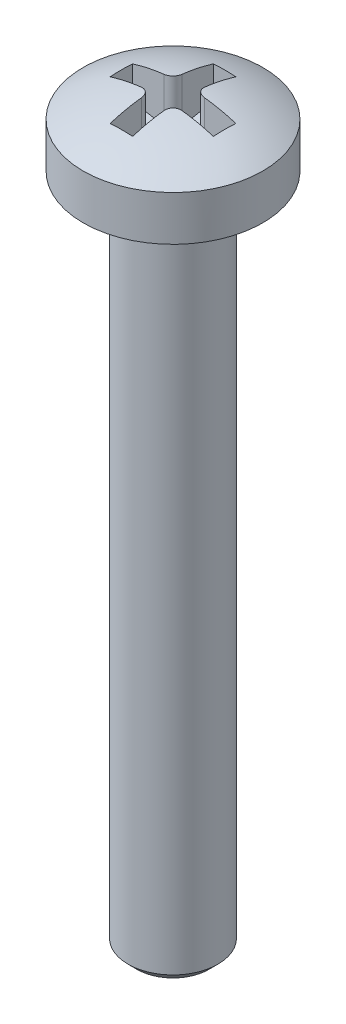
ISO-10303-21;
HEADER;
FILE_DESCRIPTION(('STEP AP214'),'2;1');
FILE_NAME('part.step','',(''),(''),'','','');
FILE_SCHEMA(('AUTOMOTIVE_DESIGN { 1 0 10303 214 1 1 1 1 }'));
ENDSEC;
DATA;
#1=APPLICATION_CONTEXT('core data for automotive mechanical design processes');
#2=APPLICATION_PROTOCOL_DEFINITION('international standard','automotive_design',2000,#1);
#3=PRODUCT_CONTEXT('',#1,'mechanical');
#4=PRODUCT('Part','Part','',(#3));
#5=PRODUCT_RELATED_PRODUCT_CATEGORY('part','',(#4));
#6=PRODUCT_DEFINITION_FORMATION('','',#4);
#7=PRODUCT_DEFINITION_CONTEXT('part definition',#1,'design');
#8=PRODUCT_DEFINITION('design','',#6,#7);
#9=PRODUCT_DEFINITION_SHAPE('','',#8);
#10=(LENGTH_UNIT() NAMED_UNIT(*) SI_UNIT(.MILLI.,.METRE.));
#11=(NAMED_UNIT(*) PLANE_ANGLE_UNIT() SI_UNIT($,.RADIAN.));
#12=(NAMED_UNIT(*) SI_UNIT($,.STERADIAN.) SOLID_ANGLE_UNIT());
#13=UNCERTAINTY_MEASURE_WITH_UNIT(LENGTH_MEASURE(1.E-05),#10,'distance_accuracy_value','');
#14=(GEOMETRIC_REPRESENTATION_CONTEXT(3) GLOBAL_UNCERTAINTY_ASSIGNED_CONTEXT((#13)) GLOBAL_UNIT_ASSIGNED_CONTEXT((#10,
#11,#12)) REPRESENTATION_CONTEXT('',''));
#15=CARTESIAN_POINT('',(0.,0.,0.));
#16=DIRECTION('',(0.,0.,1.));
#17=DIRECTION('',(1.,0.,0.));
#18=AXIS2_PLACEMENT_3D('',#15,#16,#17);
#19=CARTESIAN_POINT('',(2.,-30.,0.));
#20=DIRECTION('',(0.,1.,0.));
#21=DIRECTION('',(0.,0.,1.));
#22=AXIS2_PLACEMENT_3D('',#19,#20,#21);
#23=PLANE('',#22);
#24=CARTESIAN_POINT('',(0.,-30.,0.));
#25=DIRECTION('',(0.,1.,0.));
#26=DIRECTION('',(0.,0.,1.));
#27=AXIS2_PLACEMENT_3D('',#24,#25,#26);
#28=CIRCLE('',#27,1.60000000000001);
#29=CARTESIAN_POINT('',(0.,-30.,1.60000000000001));
#30=VERTEX_POINT('',#29);
#31=EDGE_CURVE('E11',#30,#30,#28,.F.);
#32=ORIENTED_EDGE('',*,*,#31,.T.);
#33=EDGE_LOOP('',(#32));
#34=FACE_BOUND('',#33,.T.);
#35=ADVANCED_FACE('F37',(#34),#23,.F.);
#36=CARTESIAN_POINT('',(0.,-4.72272727272728,0.));
#37=DIRECTION('',(0.,1.,0.));
#38=DIRECTION('',(1.,0.,0.));
#39=AXIS2_PLACEMENT_3D('',#36,#37,#38);
#40=SPHERICAL_SURFACE('',#39,7.82272727272728);
#41=CARTESIAN_POINT('',(0.5,-4.72272727272728,0.));
#42=DIRECTION('',(1.,0.,0.));
#43=DIRECTION('',(0.,0.,-1.));
#44=AXIS2_PLACEMENT_3D('',#41,#42,#43);
#45=CIRCLE('',#44,7.80673183755348);
#46=CARTESIAN_POINT('',(0.5,2.73750476008987,-2.3));
#47=VERTEX_POINT('',#46);
#48=CARTESIAN_POINT('',(0.5,3.03195273249996,-0.9));
#49=VERTEX_POINT('',#48);
#50=EDGE_CURVE('E195',#47,#49,#45,.T.);
#51=ORIENTED_EDGE('',*,*,#50,.T.);
#52=CARTESIAN_POINT('',(0.5,3.03195273249996,-0.9));
#53=CARTESIAN_POINT('',(0.499980445653111,3.03454133641409,-0.877715199489853));
#54=CARTESIAN_POINT('',(0.501861325410847,3.0369109081898,-0.855406290685576));
#55=CARTESIAN_POINT('',(0.509308944557218,3.04115309750786,-0.811373363194762));
#56=CARTESIAN_POINT('',(0.514874142284133,3.04302592244948,-0.789649103823202));
#57=CARTESIAN_POINT('',(0.529581237998282,3.04621922226135,-0.747382590966706));
#58=CARTESIAN_POINT('',(0.538725894104163,3.0475392695665,-0.726841263013532));
#59=CARTESIAN_POINT('',(0.560335395409864,3.04958563422558,-0.687561895208892));
#60=CARTESIAN_POINT('',(0.572799188800053,3.05031213937239,-0.668823286645484));
#61=CARTESIAN_POINT('',(0.600596407799792,3.05114682561896,-0.633816736919395));
#62=CARTESIAN_POINT('',(0.615908512897499,3.05125942358876,-0.617531968951503));
#63=CARTESIAN_POINT('',(0.649026593510928,3.0508747494218,-0.587736528915892));
#64=CARTESIAN_POINT('',(0.666832948845617,3.05037738431157,-0.57422628012003));
#65=CARTESIAN_POINT('',(0.704363578386314,3.04879030089852,-0.550401537052683));
#66=CARTESIAN_POINT('',(0.724081674108829,3.04770244181268,-0.540077170971166));
#67=CARTESIAN_POINT('',(0.764919862434989,3.04496752601447,-0.522847557382613));
#68=CARTESIAN_POINT('',(0.786039420133905,3.04332068167708,-0.515941013789886));
#69=CARTESIAN_POINT('',(0.822714805755103,3.04007942212771,-0.5072274099574));
#70=CARTESIAN_POINT('',(0.838074093965798,3.03861284502167,-0.504517057384848));
#71=CARTESIAN_POINT('',(0.868957976534767,3.0354499847468,-0.500903202638105));
#72=CARTESIAN_POINT('',(0.88448230264661,3.03375403356009,-0.499997118337815));
#73=CARTESIAN_POINT('',(0.9,3.03195273249996,-0.5));
#74=B_SPLINE_CURVE_WITH_KNOTS('',3,(#52,#53,#54,#55,#56,#57,#58,#59,#60,#61,#62,#63,#64,#65,#66,
#67,#68,#69,#70,#71,#72,#73),.UNSPECIFIED.,.F.,.F.,(4,2,2,2,2,2,2,2,2,2,4),(0.,
0.0672224170043276,0.134416723302517,0.201662907801201,0.26888780779591,0.335628401088124,
0.402379168562592,0.468920974876219,0.535437528240593,0.582332561709017,0.629160434341086),.UNSPECIFIED.);
#75=CARTESIAN_POINT('',(0.9,3.03195273249996,-0.5));
#76=VERTEX_POINT('',#75);
#77=EDGE_CURVE('E257',#49,#76,#74,.T.);
#78=ORIENTED_EDGE('',*,*,#77,.T.);
#79=CARTESIAN_POINT('',(0.,-4.72272727272728,-0.5));
#80=DIRECTION('',(0.,0.,-1.));
#81=DIRECTION('',(-1.,0.,0.));
#82=AXIS2_PLACEMENT_3D('',#79,#80,#81);
#83=CIRCLE('',#82,7.80673183755348);
#84=CARTESIAN_POINT('',(2.3,2.73750476008987,-0.5));
#85=VERTEX_POINT('',#84);
#86=EDGE_CURVE('E193',#76,#85,#83,.T.);
#87=ORIENTED_EDGE('',*,*,#86,.T.);
#88=CARTESIAN_POINT('',(2.3,-4.72272727272728,0.));
#89=DIRECTION('',(1.,0.,0.));
#90=DIRECTION('',(0.,0.,-1.));
#91=AXIS2_PLACEMENT_3D('',#88,#89,#90);
#92=CIRCLE('',#91,7.47696876972688);
#93=CARTESIAN_POINT('',(2.3,2.73750476008987,0.5));
#94=VERTEX_POINT('',#93);
#95=EDGE_CURVE('E170',#85,#94,#92,.T.);
#96=ORIENTED_EDGE('',*,*,#95,.T.);
#97=CARTESIAN_POINT('',(0.,-4.72272727272728,0.5));
#98=DIRECTION('',(0.,0.,1.));
#99=DIRECTION('',(1.,0.,0.));
#100=AXIS2_PLACEMENT_3D('',#97,#98,#99);
#101=CIRCLE('',#100,7.80673183755348);
#102=CARTESIAN_POINT('',(0.9,3.03195273249996,0.5));
#103=VERTEX_POINT('',#102);
#104=EDGE_CURVE('E219',#94,#103,#101,.T.);
#105=ORIENTED_EDGE('',*,*,#104,.T.);
#106=CARTESIAN_POINT('',(0.9,3.03195273249996,0.5));
#107=CARTESIAN_POINT('',(0.877715199489853,3.03454133641409,0.499980445653111));
#108=CARTESIAN_POINT('',(0.855406290685576,3.0369109081898,0.501861325410847));
#109=CARTESIAN_POINT('',(0.811373363194762,3.04115309750786,0.509308944557218));
#110=CARTESIAN_POINT('',(0.789649103823202,3.04302592244948,0.514874142284133));
#111=CARTESIAN_POINT('',(0.747382590966706,3.04621922226135,0.529581237998282));
#112=CARTESIAN_POINT('',(0.726841263013532,3.0475392695665,0.538725894104163));
#113=CARTESIAN_POINT('',(0.687561895208891,3.04958563422558,0.560335395409864));
#114=CARTESIAN_POINT('',(0.668823286645484,3.05031213937239,0.572799188800053));
#115=CARTESIAN_POINT('',(0.633816736919395,3.05114682561896,0.600596407799792));
#116=CARTESIAN_POINT('',(0.617531968951503,3.05125942358877,0.6159085128975));
#117=CARTESIAN_POINT('',(0.587736528915892,3.0508747494218,0.649026593510929));
#118=CARTESIAN_POINT('',(0.57422628012003,3.05037738431157,0.666832948845617));
#119=CARTESIAN_POINT('',(0.550401537052683,3.04879030089852,0.704363578386314));
#120=CARTESIAN_POINT('',(0.540077170971166,3.04770244181268,0.724081674108829));
#121=CARTESIAN_POINT('',(0.522847557382613,3.04496752601447,0.764919862434989));
#122=CARTESIAN_POINT('',(0.515941013789886,3.04332068167708,0.786039420133905));
#123=CARTESIAN_POINT('',(0.5072274099574,3.04007942212771,0.822714805755103));
#124=CARTESIAN_POINT('',(0.504517057384848,3.03861284502167,0.838074093965798));
#125=CARTESIAN_POINT('',(0.500903202638105,3.03544998474679,0.868957976534767));
#126=CARTESIAN_POINT('',(0.499997118337815,3.03375403356009,0.884482302646609));
#127=CARTESIAN_POINT('',(0.5,3.03195273249996,0.9));
#128=B_SPLINE_CURVE_WITH_KNOTS('',3,(#106,#107,#108,#109,#110,#111,#112,#113,#114,#115,#116,
#117,#118,#119,#120,#121,#122,#123,#124,#125,#126,#127),.UNSPECIFIED.,.F.,.F.,(4,2,2,2,2,2,2,2,
2,2,4),(0.,0.0672224170043276,0.134416723302517,0.201662907801201,0.268887807795911,
0.335628401088124,0.402379168562592,0.468920974876219,0.535437528240593,0.582332561709017,
0.629160434341086),.UNSPECIFIED.);
#129=CARTESIAN_POINT('',(0.5,3.03195273249996,0.9));
#130=VERTEX_POINT('',#129);
#131=EDGE_CURVE('E252',#103,#130,#128,.T.);
#132=ORIENTED_EDGE('',*,*,#131,.T.);
#133=CARTESIAN_POINT('',(0.5,-4.72272727272728,0.));
#134=DIRECTION('',(1.,0.,0.));
#135=DIRECTION('',(0.,0.,-1.));
#136=AXIS2_PLACEMENT_3D('',#133,#134,#135);
#137=CIRCLE('',#136,7.80673183755348);
#138=CARTESIAN_POINT('',(0.5,2.73750476008987,2.3));
#139=VERTEX_POINT('',#138);
#140=EDGE_CURVE('E217',#130,#139,#137,.T.);
#141=ORIENTED_EDGE('',*,*,#140,.T.);
#142=CARTESIAN_POINT('',(0.,-4.72272727272728,2.3));
#143=DIRECTION('',(0.,0.,1.));
#144=DIRECTION('',(1.,0.,0.));
#145=AXIS2_PLACEMENT_3D('',#142,#143,#144);
#146=CIRCLE('',#145,7.47696876972688);
#147=CARTESIAN_POINT('',(-0.5,2.73750476008987,2.3));
#148=VERTEX_POINT('',#147);
#149=EDGE_CURVE('E214',#139,#148,#146,.T.);
#150=ORIENTED_EDGE('',*,*,#149,.T.);
#151=CARTESIAN_POINT('',(-0.5,-4.72272727272728,0.));
#152=DIRECTION('',(-1.,0.,0.));
#153=DIRECTION('',(0.,0.,1.));
#154=AXIS2_PLACEMENT_3D('',#151,#152,#153);
#155=CIRCLE('',#154,7.80673183755348);
#156=CARTESIAN_POINT('',(-0.5,3.03195273249996,0.9));
#157=VERTEX_POINT('',#156);
#158=EDGE_CURVE('E211',#148,#157,#155,.T.);
#159=ORIENTED_EDGE('',*,*,#158,.T.);
#160=CARTESIAN_POINT('',(-0.5,3.03195273249996,0.9));
#161=CARTESIAN_POINT('',(-0.499980445653111,3.03454133641409,0.877715199489853));
#162=CARTESIAN_POINT('',(-0.501861325410847,3.0369109081898,0.855406290685576));
#163=CARTESIAN_POINT('',(-0.509308944557218,3.04115309750786,0.811373363194762));
#164=CARTESIAN_POINT('',(-0.514874142284133,3.04302592244948,0.789649103823202));
#165=CARTESIAN_POINT('',(-0.529581237998282,3.04621922226135,0.747382590966706));
#166=CARTESIAN_POINT('',(-0.538725894104163,3.0475392695665,0.726841263013532));
#167=CARTESIAN_POINT('',(-0.560335395409864,3.04958563422558,0.687561895208892));
#168=CARTESIAN_POINT('',(-0.572799188800053,3.05031213937239,0.668823286645484));
#169=CARTESIAN_POINT('',(-0.600596407799792,3.05114682561896,0.633816736919395));
#170=CARTESIAN_POINT('',(-0.6159085128975,3.05125942358876,0.617531968951503));
#171=CARTESIAN_POINT('',(-0.649026593510929,3.0508747494218,0.587736528915892));
#172=CARTESIAN_POINT('',(-0.666832948845617,3.05037738431157,0.57422628012003));
#173=CARTESIAN_POINT('',(-0.704363578386314,3.04879030089852,0.550401537052683));
#174=CARTESIAN_POINT('',(-0.724081674108829,3.04770244181268,0.540077170971166));
#175=CARTESIAN_POINT('',(-0.764919862434989,3.04496752601447,0.522847557382613));
#176=CARTESIAN_POINT('',(-0.786039420133905,3.04332068167708,0.515941013789887));
#177=CARTESIAN_POINT('',(-0.822714805755103,3.04007942212771,0.5072274099574));
#178=CARTESIAN_POINT('',(-0.838074093965798,3.03861284502167,0.504517057384848));
#179=CARTESIAN_POINT('',(-0.868957976534767,3.0354499847468,0.500903202638105));
#180=CARTESIAN_POINT('',(-0.88448230264661,3.03375403356009,0.499997118337815));
#181=CARTESIAN_POINT('',(-0.9,3.03195273249996,0.5));
#182=B_SPLINE_CURVE_WITH_KNOTS('',3,(#160,#161,#162,#163,#164,#165,#166,#167,#168,#169,#170,
#171,#172,#173,#174,#175,#176,#177,#178,#179,#180,#181),.UNSPECIFIED.,.F.,.F.,(4,2,2,2,2,2,2,2,
2,2,4),(0.,0.0672224170043276,0.134416723302517,0.201662907801201,0.26888780779591,
0.335628401088124,0.402379168562592,0.468920974876219,0.535437528240592,0.582332561709017,
0.629160434341086),.UNSPECIFIED.);
#183=CARTESIAN_POINT('',(-0.9,3.03195273249996,0.5));
#184=VERTEX_POINT('',#183);
#185=EDGE_CURVE('E231',#157,#184,#182,.T.);
#186=ORIENTED_EDGE('',*,*,#185,.T.);
#187=CARTESIAN_POINT('',(0.,-4.72272727272728,0.5));
#188=DIRECTION('',(0.,0.,1.));
#189=DIRECTION('',(1.,0.,0.));
#190=AXIS2_PLACEMENT_3D('',#187,#188,#189);
#191=CIRCLE('',#190,7.80673183755348);
#192=CARTESIAN_POINT('',(-2.3,2.73750476008987,0.5));
#193=VERTEX_POINT('',#192);
#194=EDGE_CURVE('E209',#184,#193,#191,.T.);
#195=ORIENTED_EDGE('',*,*,#194,.T.);
#196=CARTESIAN_POINT('',(-2.3,-4.72272727272728,0.));
#197=DIRECTION('',(-1.,0.,0.));
#198=DIRECTION('',(0.,0.,1.));
#199=AXIS2_PLACEMENT_3D('',#196,#197,#198);
#200=CIRCLE('',#199,7.47696876972688);
#201=CARTESIAN_POINT('',(-2.3,2.73750476008987,-0.5));
#202=VERTEX_POINT('',#201);
#203=EDGE_CURVE('E206',#193,#202,#200,.T.);
#204=ORIENTED_EDGE('',*,*,#203,.T.);
#205=CARTESIAN_POINT('',(0.,-4.72272727272728,-0.5));
#206=DIRECTION('',(0.,0.,-1.));
#207=DIRECTION('',(-1.,0.,0.));
#208=AXIS2_PLACEMENT_3D('',#205,#206,#207);
#209=CIRCLE('',#208,7.80673183755348);
#210=CARTESIAN_POINT('',(-0.9,3.03195273249996,-0.5));
#211=VERTEX_POINT('',#210);
#212=EDGE_CURVE('E203',#202,#211,#209,.T.);
#213=ORIENTED_EDGE('',*,*,#212,.T.);
#214=CARTESIAN_POINT('',(-0.9,3.03195273249996,-0.5));
#215=CARTESIAN_POINT('',(-0.877715199489853,3.03454133641409,-0.499980445653111));
#216=CARTESIAN_POINT('',(-0.855406290685576,3.0369109081898,-0.501861325410847));
#217=CARTESIAN_POINT('',(-0.811373363194762,3.04115309750786,-0.509308944557218));
#218=CARTESIAN_POINT('',(-0.789649103823202,3.04302592244948,-0.514874142284133));
#219=CARTESIAN_POINT('',(-0.747382590966706,3.04621922226135,-0.529581237998282));
#220=CARTESIAN_POINT('',(-0.726841263013532,3.0475392695665,-0.538725894104163));
#221=CARTESIAN_POINT('',(-0.687561895208892,3.04958563422558,-0.560335395409864));
#222=CARTESIAN_POINT('',(-0.668823286645484,3.05031213937239,-0.572799188800053));
#223=CARTESIAN_POINT('',(-0.633816736919395,3.05114682561896,-0.600596407799792));
#224=CARTESIAN_POINT('',(-0.617531968951503,3.05125942358877,-0.6159085128975));
#225=CARTESIAN_POINT('',(-0.587736528915892,3.0508747494218,-0.649026593510929));
#226=CARTESIAN_POINT('',(-0.57422628012003,3.05037738431157,-0.666832948845617));
#227=CARTESIAN_POINT('',(-0.550401537052683,3.04879030089852,-0.704363578386314));
#228=CARTESIAN_POINT('',(-0.540077170971166,3.04770244181268,-0.724081674108829));
#229=CARTESIAN_POINT('',(-0.522847557382613,3.04496752601447,-0.764919862434989));
#230=CARTESIAN_POINT('',(-0.515941013789887,3.04332068167708,-0.786039420133905));
#231=CARTESIAN_POINT('',(-0.5072274099574,3.04007942212771,-0.822714805755103));
#232=CARTESIAN_POINT('',(-0.504517057384848,3.03861284502167,-0.838074093965798));
#233=CARTESIAN_POINT('',(-0.500903202638105,3.03544998474679,-0.868957976534767));
#234=CARTESIAN_POINT('',(-0.499997118337815,3.03375403356009,-0.88448230264661));
#235=CARTESIAN_POINT('',(-0.5,3.03195273249996,-0.9));
#236=B_SPLINE_CURVE_WITH_KNOTS('',3,(#214,#215,#216,#217,#218,#219,#220,#221,#222,#223,#224,
#225,#226,#227,#228,#229,#230,#231,#232,#233,#234,#235),.UNSPECIFIED.,.F.,.F.,(4,2,2,2,2,2,2,2,
2,2,4),(0.,0.0672224170043276,0.134416723302517,0.201662907801201,0.268887807795911,
0.335628401088124,0.402379168562592,0.468920974876219,0.535437528240593,0.582332561709018,
0.629160434341086),.UNSPECIFIED.);
#237=CARTESIAN_POINT('',(-0.5,3.03195273249996,-0.9));
#238=VERTEX_POINT('',#237);
#239=EDGE_CURVE('E225',#211,#238,#236,.T.);
#240=ORIENTED_EDGE('',*,*,#239,.T.);
#241=CARTESIAN_POINT('',(-0.5,-4.72272727272728,0.));
#242=DIRECTION('',(-1.,0.,0.));
#243=DIRECTION('',(0.,0.,1.));
#244=AXIS2_PLACEMENT_3D('',#241,#242,#243);
#245=CIRCLE('',#244,7.80673183755348);
#246=CARTESIAN_POINT('',(-0.5,2.73750476008987,-2.3));
#247=VERTEX_POINT('',#246);
#248=EDGE_CURVE('E201',#238,#247,#245,.T.);
#249=ORIENTED_EDGE('',*,*,#248,.T.);
#250=CARTESIAN_POINT('',(0.,-4.72272727272728,-2.3));
#251=DIRECTION('',(0.,0.,-1.));
#252=DIRECTION('',(-1.,0.,0.));
#253=AXIS2_PLACEMENT_3D('',#250,#251,#252);
#254=CIRCLE('',#253,7.47696876972688);
#255=EDGE_CURVE('E198',#247,#47,#254,.T.);
#256=ORIENTED_EDGE('',*,*,#255,.T.);
#257=EDGE_LOOP('',(#51,#78,#87,#96,#105,#132,#141,#150,#159,#186,#195,#204,#213,#240,#249,#256));
#258=FACE_BOUND('',#257,.T.);
#259=CARTESIAN_POINT('',(0.,2.,0.));
#260=DIRECTION('',(0.,1.,0.));
#261=DIRECTION('',(0.,0.,1.));
#262=AXIS2_PLACEMENT_3D('',#259,#260,#261);
#263=CIRCLE('',#262,4.);
#264=CARTESIAN_POINT('',(0.,2.,4.));
#265=VERTEX_POINT('',#264);
#266=EDGE_CURVE('E189',#265,#265,#263,.T.);
#267=ORIENTED_EDGE('',*,*,#266,.T.);
#268=EDGE_LOOP('',(#267));
#269=FACE_BOUND('',#268,.T.);
#270=ADVANCED_FACE('F239',(#258,#269),#40,.T.);
#271=CARTESIAN_POINT('',(0.,3.1,0.));
#272=DIRECTION('',(0.,1.,0.));
#273=DIRECTION('',(0.,0.,1.));
#274=AXIS2_PLACEMENT_3D('',#271,#272,#273);
#275=CYLINDRICAL_SURFACE('',#274,4.);
#276=ORIENTED_EDGE('',*,*,#266,.F.);
#277=EDGE_LOOP('',(#276));
#278=FACE_BOUND('',#277,.T.);
#279=CARTESIAN_POINT('',(0.,0.,0.));
#280=DIRECTION('',(0.,1.,0.));
#281=DIRECTION('',(0.,0.,1.));
#282=AXIS2_PLACEMENT_3D('',#279,#280,#281);
#283=CIRCLE('',#282,4.);
#284=CARTESIAN_POINT('',(0.,0.,4.));
#285=VERTEX_POINT('',#284);
#286=EDGE_CURVE('E181',#285,#285,#283,.T.);
#287=ORIENTED_EDGE('',*,*,#286,.T.);
#288=EDGE_LOOP('',(#287));
#289=FACE_BOUND('',#288,.T.);
#290=ADVANCED_FACE('F244',(#278,#289),#275,.T.);
#291=CARTESIAN_POINT('',(4.,0.,0.));
#292=DIRECTION('',(0.,1.,0.));
#293=DIRECTION('',(0.,0.,1.));
#294=AXIS2_PLACEMENT_3D('',#291,#292,#293);
#295=PLANE('',#294);
#296=ORIENTED_EDGE('',*,*,#286,.F.);
#297=EDGE_LOOP('',(#296));
#298=FACE_BOUND('',#297,.T.);
#299=CARTESIAN_POINT('',(0.,0.,0.));
#300=DIRECTION('',(0.,1.,0.));
#301=DIRECTION('',(0.,0.,1.));
#302=AXIS2_PLACEMENT_3D('',#299,#300,#301);
#303=CIRCLE('',#302,2.);
#304=CARTESIAN_POINT('',(0.,0.,2.));
#305=VERTEX_POINT('',#304);
#306=EDGE_CURVE('E178',#305,#305,#303,.T.);
#307=ORIENTED_EDGE('',*,*,#306,.T.);
#308=EDGE_LOOP('',(#307));
#309=FACE_BOUND('',#308,.T.);
#310=ADVANCED_FACE('F331',(#298,#309),#295,.F.);
#311=CARTESIAN_POINT('',(0.,3.1,0.));
#312=DIRECTION('',(0.,1.,0.));
#313=DIRECTION('',(0.,0.,1.));
#314=AXIS2_PLACEMENT_3D('',#311,#312,#313);
#315=CYLINDRICAL_SURFACE('',#314,2.);
#316=CARTESIAN_POINT('',(0.,-29.6,0.));
#317=DIRECTION('',(0.,1.,0.));
#318=DIRECTION('',(0.,0.,1.));
#319=AXIS2_PLACEMENT_3D('',#316,#317,#318);
#320=CIRCLE('',#319,2.);
#321=CARTESIAN_POINT('',(0.,-29.6,2.));
#322=VERTEX_POINT('',#321);
#323=EDGE_CURVE('E45',#322,#322,#320,.T.);
#324=ORIENTED_EDGE('',*,*,#323,.T.);
#325=EDGE_LOOP('',(#324));
#326=FACE_BOUND('',#325,.T.);
#327=ORIENTED_EDGE('',*,*,#306,.F.);
#328=EDGE_LOOP('',(#327));
#329=FACE_BOUND('',#328,.T.);
#330=ADVANCED_FACE('F303',(#326,#329),#315,.T.);
#331=CARTESIAN_POINT('',(0.5,-30.001,0.5));
#332=DIRECTION('',(0.,0.,1.));
#333=DIRECTION('',(1.,0.,0.));
#334=AXIS2_PLACEMENT_3D('',#331,#332,#333);
#335=PLANE('',#334);
#336=CARTESIAN_POINT('',(0.,9.49999999999998,0.5));
#337=DIRECTION('',(0.,0.,1.));
#338=DIRECTION('',(1.,0.,0.));
#339=AXIS2_PLACEMENT_3D('',#336,#337,#338);
#340=CIRCLE('',#339,8.48528137423855);
#341=CARTESIAN_POINT('',(2.3,1.3323810079069,0.5));
#342=VERTEX_POINT('',#341);
#343=CARTESIAN_POINT('',(0.9,1.06258333374486,0.5));
#344=VERTEX_POINT('',#343);
#345=EDGE_CURVE('E176',#342,#344,#340,.F.);
#346=ORIENTED_EDGE('',*,*,#345,.T.);
#347=DIRECTION('',(0.,1.,0.));
#348=VECTOR('',#347,1.);
#349=CARTESIAN_POINT('',(0.9,-30.001,0.5));
#350=LINE('',#349,#348);
#351=EDGE_CURVE('E556',#344,#103,#350,.T.);
#352=ORIENTED_EDGE('',*,*,#351,.T.);
#353=ORIENTED_EDGE('',*,*,#104,.F.);
#354=DIRECTION('',(0.,1.,0.));
#355=VECTOR('',#354,1.);
#356=CARTESIAN_POINT('',(2.3,-30.001,0.5));
#357=LINE('',#356,#355);
#358=EDGE_CURVE('E172',#342,#94,#357,.T.);
#359=ORIENTED_EDGE('',*,*,#358,.F.);
#360=EDGE_LOOP('',(#346,#352,#353,#359));
#361=FACE_BOUND('',#360,.T.);
#362=ADVANCED_FACE('F344',(#361),#335,.F.);
#363=CARTESIAN_POINT('',(0.5,-30.001,0.5));
#364=DIRECTION('',(1.,0.,0.));
#365=DIRECTION('',(0.,0.,-1.));
#366=AXIS2_PLACEMENT_3D('',#363,#364,#365);
#367=PLANE('',#366);
#368=ORIENTED_EDGE('',*,*,#140,.F.);
#369=DIRECTION('',(0.,1.,0.));
#370=VECTOR('',#369,1.);
#371=CARTESIAN_POINT('',(0.5,-30.001,0.9));
#372=LINE('',#371,#370);
#373=CARTESIAN_POINT('',(0.5,1.06258333374486,0.9));
#374=VERTEX_POINT('',#373);
#375=EDGE_CURVE('E554',#130,#374,#372,.F.);
#376=ORIENTED_EDGE('',*,*,#375,.T.);
#377=CARTESIAN_POINT('',(0.5,9.49999999999998,0.));
#378=DIRECTION('',(1.,0.,0.));
#379=DIRECTION('',(0.,0.,-1.));
#380=AXIS2_PLACEMENT_3D('',#377,#378,#379);
#381=CIRCLE('',#380,8.48528137423855);
#382=CARTESIAN_POINT('',(0.5,1.3323810079069,2.3));
#383=VERTEX_POINT('',#382);
#384=EDGE_CURVE('E183',#374,#383,#381,.F.);
#385=ORIENTED_EDGE('',*,*,#384,.T.);
#386=DIRECTION('',(0.,1.,0.));
#387=VECTOR('',#386,1.);
#388=CARTESIAN_POINT('',(0.5,-30.001,2.3));
#389=LINE('',#388,#387);
#390=EDGE_CURVE('E162',#383,#139,#389,.T.);
#391=ORIENTED_EDGE('',*,*,#390,.T.);
#392=EDGE_LOOP('',(#368,#376,#385,#391));
#393=FACE_BOUND('',#392,.T.);
#394=ADVANCED_FACE('F292',(#393),#367,.F.);
#395=CARTESIAN_POINT('',(-0.5,-30.001,2.3));
#396=DIRECTION('',(0.,0.,1.));
#397=DIRECTION('',(1.,0.,0.));
#398=AXIS2_PLACEMENT_3D('',#395,#396,#397);
#399=PLANE('',#398);
#400=ORIENTED_EDGE('',*,*,#390,.F.);
#401=CARTESIAN_POINT('',(0.,9.49999999999998,2.3));
#402=DIRECTION('',(0.,0.,1.));
#403=DIRECTION('',(1.,0.,0.));
#404=AXIS2_PLACEMENT_3D('',#401,#402,#403);
#405=CIRCLE('',#404,8.18290901819149);
#406=CARTESIAN_POINT('',(-0.5,1.3323810079069,2.3));
#407=VERTEX_POINT('',#406);
#408=EDGE_CURVE('E518',#383,#407,#405,.F.);
#409=ORIENTED_EDGE('',*,*,#408,.T.);
#410=DIRECTION('',(0.,1.,0.));
#411=VECTOR('',#410,1.);
#412=CARTESIAN_POINT('',(-0.5,-30.001,2.3));
#413=LINE('',#412,#411);
#414=EDGE_CURVE('E517',#407,#148,#413,.T.);
#415=ORIENTED_EDGE('',*,*,#414,.T.);
#416=ORIENTED_EDGE('',*,*,#149,.F.);
#417=EDGE_LOOP('',(#400,#409,#415,#416));
#418=FACE_BOUND('',#417,.T.);
#419=ADVANCED_FACE('F357',(#418),#399,.F.);
#420=CARTESIAN_POINT('',(-0.5,-30.001,0.5));
#421=DIRECTION('',(-1.,0.,0.));
#422=DIRECTION('',(0.,0.,1.));
#423=AXIS2_PLACEMENT_3D('',#420,#421,#422);
#424=PLANE('',#423);
#425=CARTESIAN_POINT('',(-0.5,9.49999999999998,0.));
#426=DIRECTION('',(-1.,0.,0.));
#427=DIRECTION('',(0.,0.,1.));
#428=AXIS2_PLACEMENT_3D('',#425,#426,#427);
#429=CIRCLE('',#428,8.48528137423855);
#430=CARTESIAN_POINT('',(-0.5,1.06258333374486,0.9));
#431=VERTEX_POINT('',#430);
#432=EDGE_CURVE('E512',#407,#431,#429,.F.);
#433=ORIENTED_EDGE('',*,*,#432,.T.);
#434=DIRECTION('',(0.,1.,0.));
#435=VECTOR('',#434,1.);
#436=CARTESIAN_POINT('',(-0.5,-30.001,0.9));
#437=LINE('',#436,#435);
#438=EDGE_CURVE('E507',#431,#157,#437,.T.);
#439=ORIENTED_EDGE('',*,*,#438,.T.);
#440=ORIENTED_EDGE('',*,*,#158,.F.);
#441=ORIENTED_EDGE('',*,*,#414,.F.);
#442=EDGE_LOOP('',(#433,#439,#440,#441));
#443=FACE_BOUND('',#442,.T.);
#444=ADVANCED_FACE('F364',(#443),#424,.F.);
#445=CARTESIAN_POINT('',(-2.3,-30.001,0.5));
#446=DIRECTION('',(0.,0.,1.));
#447=DIRECTION('',(1.,0.,0.));
#448=AXIS2_PLACEMENT_3D('',#445,#446,#447);
#449=PLANE('',#448);
#450=ORIENTED_EDGE('',*,*,#194,.F.);
#451=DIRECTION('',(0.,1.,0.));
#452=VECTOR('',#451,1.);
#453=CARTESIAN_POINT('',(-0.9,-30.001,0.5));
#454=LINE('',#453,#452);
#455=CARTESIAN_POINT('',(-0.9,1.06258333374486,0.5));
#456=VERTEX_POINT('',#455);
#457=EDGE_CURVE('E505',#184,#456,#454,.F.);
#458=ORIENTED_EDGE('',*,*,#457,.T.);
#459=CARTESIAN_POINT('',(0.,9.49999999999998,0.5));
#460=DIRECTION('',(0.,0.,1.));
#461=DIRECTION('',(1.,0.,0.));
#462=AXIS2_PLACEMENT_3D('',#459,#460,#461);
#463=CIRCLE('',#462,8.48528137423855);
#464=CARTESIAN_POINT('',(-2.3,1.3323810079069,0.5));
#465=VERTEX_POINT('',#464);
#466=EDGE_CURVE('E515',#456,#465,#463,.F.);
#467=ORIENTED_EDGE('',*,*,#466,.T.);
#468=DIRECTION('',(0.,1.,0.));
#469=VECTOR('',#468,1.);
#470=CARTESIAN_POINT('',(-2.3,-30.001,0.5));
#471=LINE('',#470,#469);
#472=EDGE_CURVE('E529',#465,#193,#471,.T.);
#473=ORIENTED_EDGE('',*,*,#472,.T.);
#474=EDGE_LOOP('',(#450,#458,#467,#473));
#475=FACE_BOUND('',#474,.T.);
#476=ADVANCED_FACE('F371',(#475),#449,.F.);
#477=CARTESIAN_POINT('',(-2.3,-30.001,-0.5));
#478=DIRECTION('',(-1.,0.,0.));
#479=DIRECTION('',(0.,0.,1.));
#480=AXIS2_PLACEMENT_3D('',#477,#478,#479);
#481=PLANE('',#480);
#482=ORIENTED_EDGE('',*,*,#472,.F.);
#483=CARTESIAN_POINT('',(-2.3,9.49999999999998,0.));
#484=DIRECTION('',(-1.,0.,0.));
#485=DIRECTION('',(0.,0.,1.));
#486=AXIS2_PLACEMENT_3D('',#483,#484,#485);
#487=CIRCLE('',#486,8.18290901819149);
#488=CARTESIAN_POINT('',(-2.3,1.3323810079069,-0.5));
#489=VERTEX_POINT('',#488);
#490=EDGE_CURVE('E521',#465,#489,#487,.F.);
#491=ORIENTED_EDGE('',*,*,#490,.T.);
#492=DIRECTION('',(0.,1.,0.));
#493=VECTOR('',#492,1.);
#494=CARTESIAN_POINT('',(-2.3,-30.001,-0.5));
#495=LINE('',#494,#493);
#496=EDGE_CURVE('E532',#489,#202,#495,.T.);
#497=ORIENTED_EDGE('',*,*,#496,.T.);
#498=ORIENTED_EDGE('',*,*,#203,.F.);
#499=EDGE_LOOP('',(#482,#491,#497,#498));
#500=FACE_BOUND('',#499,.T.);
#501=ADVANCED_FACE('F379',(#500),#481,.F.);
#502=CARTESIAN_POINT('',(-2.3,-30.001,-0.5));
#503=DIRECTION('',(0.,0.,-1.));
#504=DIRECTION('',(-1.,0.,0.));
#505=AXIS2_PLACEMENT_3D('',#502,#503,#504);
#506=PLANE('',#505);
#507=CARTESIAN_POINT('',(0.,9.49999999999998,-0.5));
#508=DIRECTION('',(0.,0.,-1.));
#509=DIRECTION('',(-1.,0.,0.));
#510=AXIS2_PLACEMENT_3D('',#507,#508,#509);
#511=CIRCLE('',#510,8.48528137423855);
#512=CARTESIAN_POINT('',(-0.9,1.06258333374486,-0.5));
#513=VERTEX_POINT('',#512);
#514=EDGE_CURVE('E564',#489,#513,#511,.F.);
#515=ORIENTED_EDGE('',*,*,#514,.T.);
#516=DIRECTION('',(0.,1.,0.));
#517=VECTOR('',#516,1.);
#518=CARTESIAN_POINT('',(-0.9,-30.001,-0.5));
#519=LINE('',#518,#517);
#520=EDGE_CURVE('E549',#513,#211,#519,.T.);
#521=ORIENTED_EDGE('',*,*,#520,.T.);
#522=ORIENTED_EDGE('',*,*,#212,.F.);
#523=ORIENTED_EDGE('',*,*,#496,.F.);
#524=EDGE_LOOP('',(#515,#521,#522,#523));
#525=FACE_BOUND('',#524,.T.);
#526=ADVANCED_FACE('F387',(#525),#506,.F.);
#527=CARTESIAN_POINT('',(-0.5,-30.001,-2.3));
#528=DIRECTION('',(-1.,0.,0.));
#529=DIRECTION('',(0.,0.,1.));
#530=AXIS2_PLACEMENT_3D('',#527,#528,#529);
#531=PLANE('',#530);
#532=ORIENTED_EDGE('',*,*,#248,.F.);
#533=DIRECTION('',(0.,1.,0.));
#534=VECTOR('',#533,1.);
#535=CARTESIAN_POINT('',(-0.5,-30.001,-0.9));
#536=LINE('',#535,#534);
#537=CARTESIAN_POINT('',(-0.5,1.06258333374486,-0.9));
#538=VERTEX_POINT('',#537);
#539=EDGE_CURVE('E52',#238,#538,#536,.F.);
#540=ORIENTED_EDGE('',*,*,#539,.T.);
#541=CARTESIAN_POINT('',(-0.5,9.49999999999998,0.));
#542=DIRECTION('',(-1.,0.,0.));
#543=DIRECTION('',(0.,0.,1.));
#544=AXIS2_PLACEMENT_3D('',#541,#542,#543);
#545=CIRCLE('',#544,8.48528137423855);
#546=CARTESIAN_POINT('',(-0.5,1.3323810079069,-2.3));
#547=VERTEX_POINT('',#546);
#548=EDGE_CURVE('E560',#538,#547,#545,.F.);
#549=ORIENTED_EDGE('',*,*,#548,.T.);
#550=DIRECTION('',(0.,1.,0.));
#551=VECTOR('',#550,1.);
#552=CARTESIAN_POINT('',(-0.5,-30.001,-2.3));
#553=LINE('',#552,#551);
#554=EDGE_CURVE('E535',#547,#247,#553,.T.);
#555=ORIENTED_EDGE('',*,*,#554,.T.);
#556=EDGE_LOOP('',(#532,#540,#549,#555));
#557=FACE_BOUND('',#556,.T.);
#558=ADVANCED_FACE('F395',(#557),#531,.F.);
#559=CARTESIAN_POINT('',(-0.5,-30.001,-2.3));
#560=DIRECTION('',(0.,0.,-1.));
#561=DIRECTION('',(-1.,0.,0.));
#562=AXIS2_PLACEMENT_3D('',#559,#560,#561);
#563=PLANE('',#562);
#564=ORIENTED_EDGE('',*,*,#554,.F.);
#565=CARTESIAN_POINT('',(0.,9.49999999999998,-2.3));
#566=DIRECTION('',(0.,0.,-1.));
#567=DIRECTION('',(-1.,0.,0.));
#568=AXIS2_PLACEMENT_3D('',#565,#566,#567);
#569=CIRCLE('',#568,8.18290901819149);
#570=CARTESIAN_POINT('',(0.5,1.3323810079069,-2.3));
#571=VERTEX_POINT('',#570);
#572=EDGE_CURVE('E543',#547,#571,#569,.F.);
#573=ORIENTED_EDGE('',*,*,#572,.T.);
#574=DIRECTION('',(0.,1.,0.));
#575=VECTOR('',#574,1.);
#576=CARTESIAN_POINT('',(0.5,-30.001,-2.3));
#577=LINE('',#576,#575);
#578=EDGE_CURVE('E171',#571,#47,#577,.T.);
#579=ORIENTED_EDGE('',*,*,#578,.T.);
#580=ORIENTED_EDGE('',*,*,#255,.F.);
#581=EDGE_LOOP('',(#564,#573,#579,#580));
#582=FACE_BOUND('',#581,.T.);
#583=ADVANCED_FACE('F403',(#582),#563,.F.);
#584=CARTESIAN_POINT('',(0.5,-30.001,-2.3));
#585=DIRECTION('',(1.,0.,0.));
#586=DIRECTION('',(0.,0.,-1.));
#587=AXIS2_PLACEMENT_3D('',#584,#585,#586);
#588=PLANE('',#587);
#589=CARTESIAN_POINT('',(0.5,9.49999999999998,0.));
#590=DIRECTION('',(1.,0.,0.));
#591=DIRECTION('',(0.,0.,-1.));
#592=AXIS2_PLACEMENT_3D('',#589,#590,#591);
#593=CIRCLE('',#592,8.48528137423855);
#594=CARTESIAN_POINT('',(0.5,1.06258333374486,-0.9));
#595=VERTEX_POINT('',#594);
#596=EDGE_CURVE('E161',#571,#595,#593,.F.);
#597=ORIENTED_EDGE('',*,*,#596,.T.);
#598=DIRECTION('',(0.,1.,0.));
#599=VECTOR('',#598,1.);
#600=CARTESIAN_POINT('',(0.5,-30.001,-0.9));
#601=LINE('',#600,#599);
#602=EDGE_CURVE('E222',#595,#49,#601,.T.);
#603=ORIENTED_EDGE('',*,*,#602,.T.);
#604=ORIENTED_EDGE('',*,*,#50,.F.);
#605=ORIENTED_EDGE('',*,*,#578,.F.);
#606=EDGE_LOOP('',(#597,#603,#604,#605));
#607=FACE_BOUND('',#606,.T.);
#608=ADVANCED_FACE('F410',(#607),#588,.F.);
#609=CARTESIAN_POINT('',(0.5,-30.001,-0.5));
#610=DIRECTION('',(0.,0.,-1.));
#611=DIRECTION('',(-1.,0.,0.));
#612=AXIS2_PLACEMENT_3D('',#609,#610,#611);
#613=PLANE('',#612);
#614=ORIENTED_EDGE('',*,*,#86,.F.);
#615=DIRECTION('',(0.,1.,0.));
#616=VECTOR('',#615,1.);
#617=CARTESIAN_POINT('',(0.9,-30.001,-0.5));
#618=LINE('',#617,#616);
#619=CARTESIAN_POINT('',(0.9,1.06258333374486,-0.5));
#620=VERTEX_POINT('',#619);
#621=EDGE_CURVE('E158',#76,#620,#618,.F.);
#622=ORIENTED_EDGE('',*,*,#621,.T.);
#623=CARTESIAN_POINT('',(0.,9.49999999999998,-0.5));
#624=DIRECTION('',(0.,0.,-1.));
#625=DIRECTION('',(-1.,0.,0.));
#626=AXIS2_PLACEMENT_3D('',#623,#624,#625);
#627=CIRCLE('',#626,8.48528137423855);
#628=CARTESIAN_POINT('',(2.3,1.3323810079069,-0.5));
#629=VERTEX_POINT('',#628);
#630=EDGE_CURVE('E152',#620,#629,#627,.F.);
#631=ORIENTED_EDGE('',*,*,#630,.T.);
#632=DIRECTION('',(0.,1.,0.));
#633=VECTOR('',#632,1.);
#634=CARTESIAN_POINT('',(2.3,-30.001,-0.5));
#635=LINE('',#634,#633);
#636=EDGE_CURVE('E156',#629,#85,#635,.T.);
#637=ORIENTED_EDGE('',*,*,#636,.T.);
#638=EDGE_LOOP('',(#614,#622,#631,#637));
#639=FACE_BOUND('',#638,.T.);
#640=ADVANCED_FACE('F155',(#639),#613,.F.);
#641=CARTESIAN_POINT('',(2.3,-30.001,-0.5));
#642=DIRECTION('',(1.,0.,0.));
#643=DIRECTION('',(0.,0.,-1.));
#644=AXIS2_PLACEMENT_3D('',#641,#642,#643);
#645=PLANE('',#644);
#646=ORIENTED_EDGE('',*,*,#636,.F.);
#647=CARTESIAN_POINT('',(2.3,9.49999999999998,0.));
#648=DIRECTION('',(1.,0.,0.));
#649=DIRECTION('',(0.,0.,-1.));
#650=AXIS2_PLACEMENT_3D('',#647,#648,#649);
#651=CIRCLE('',#650,8.18290901819149);
#652=EDGE_CURVE('E167',#629,#342,#651,.F.);
#653=ORIENTED_EDGE('',*,*,#652,.T.);
#654=ORIENTED_EDGE('',*,*,#358,.T.);
#655=ORIENTED_EDGE('',*,*,#95,.F.);
#656=EDGE_LOOP('',(#646,#653,#654,#655));
#657=FACE_BOUND('',#656,.T.);
#658=ADVANCED_FACE('F166',(#657),#645,.F.);
#659=CARTESIAN_POINT('',(0.,9.49999999999998,0.));
#660=DIRECTION('',(0.,1.,0.));
#661=DIRECTION('',(1.,0.,0.));
#662=AXIS2_PLACEMENT_3D('',#659,#660,#661);
#663=SPHERICAL_SURFACE('',#662,8.49999999999998);
#664=ORIENTED_EDGE('',*,*,#345,.F.);
#665=ORIENTED_EDGE('',*,*,#652,.F.);
#666=ORIENTED_EDGE('',*,*,#630,.F.);
#667=CARTESIAN_POINT('',(0.9,1.06258333374486,-0.5));
#668=CARTESIAN_POINT('',(0.877681895176581,1.06020064583187,-0.499980506377996));
#669=CARTESIAN_POINT('',(0.855344205727362,1.0580201488652,-0.501866869905914));
#670=CARTESIAN_POINT('',(0.811264196369215,1.05411756501269,-0.509332340473144));
#671=CARTESIAN_POINT('',(0.78952159882242,1.05239526097159,-0.514909693823375));
#672=CARTESIAN_POINT('',(0.747228556255667,1.04945966047884,-0.529643735623788));
#673=CARTESIAN_POINT('',(0.726678990033897,1.04824673524169,-0.538803025087882));
#674=CARTESIAN_POINT('',(0.687389852539137,1.04636746374655,-0.560442280349619));
#675=CARTESIAN_POINT('',(0.668649749482246,1.04570095646757,-0.572921266446781));
#676=CARTESIAN_POINT('',(0.633625729643449,1.04493649451643,-0.600763861630353));
#677=CARTESIAN_POINT('',(0.617327507926939,1.04483509156346,-0.616109383561911));
#678=CARTESIAN_POINT('',(0.587514637710959,1.04519463942213,-0.649299998886555));
#679=CARTESIAN_POINT('',(0.574000432084661,1.04565567962496,-0.667145489209941));
#680=CARTESIAN_POINT('',(0.55017165377276,1.04712438551599,-0.704769667803527));
#681=CARTESIAN_POINT('',(0.539848822620757,1.04813062146146,-0.724543189195622));
#682=CARTESIAN_POINT('',(0.522637980126425,1.05065941614313,-0.765498290560969));
#683=CARTESIAN_POINT('',(0.515748559609182,1.05218176262027,-0.78667928881133));
#684=CARTESIAN_POINT('',(0.507116958212197,1.05516459963325,-0.823303350164225));
#685=CARTESIAN_POINT('',(0.504448298653858,1.05650461680506,-0.838544928463922));
#686=CARTESIAN_POINT('',(0.500889732891837,1.05939256924764,-0.869192646434852));
#687=CARTESIAN_POINT('',(0.499997287547255,1.06094020433808,-0.884598519500552));
#688=CARTESIAN_POINT('',(0.5,1.06258333374486,-0.9));
#689=B_SPLINE_CURVE_WITH_KNOTS('',3,(#667,#668,#669,#670,#671,#672,#673,#674,#675,#676,#677,
#678,#679,#680,#681,#682,#683,#684,#685,#686,#687,#688),.UNSPECIFIED.,.F.,.F.,(4,2,2,2,2,2,2,2,
2,2,4),(0.,0.0672520458092346,0.134472161271656,0.201741179358209,0.268990367163335,
0.33582874565086,0.402677748396607,0.469352286257207,0.535999436300152,0.582495090258099,
0.628924229684279),.UNSPECIFIED.);
#690=EDGE_CURVE('E280',#620,#595,#689,.T.);
#691=ORIENTED_EDGE('',*,*,#690,.T.);
#692=ORIENTED_EDGE('',*,*,#596,.F.);
#693=ORIENTED_EDGE('',*,*,#572,.F.);
#694=ORIENTED_EDGE('',*,*,#548,.F.);
#695=CARTESIAN_POINT('',(-0.5,1.06258333374486,-0.9));
#696=CARTESIAN_POINT('',(-0.499980506377996,1.06020064583187,-0.877681895176581));
#697=CARTESIAN_POINT('',(-0.501866869905914,1.0580201488652,-0.855344205727362));
#698=CARTESIAN_POINT('',(-0.509332340473144,1.05411756501269,-0.811264196369215));
#699=CARTESIAN_POINT('',(-0.514909693823375,1.05239526097159,-0.789521598822421));
#700=CARTESIAN_POINT('',(-0.529643735623788,1.04945966047884,-0.747228556255667));
#701=CARTESIAN_POINT('',(-0.538803025087882,1.04824673524169,-0.726678990033897));
#702=CARTESIAN_POINT('',(-0.56044228034962,1.04636746374655,-0.687389852539137));
#703=CARTESIAN_POINT('',(-0.572921266446781,1.04570095646757,-0.668649749482246));
#704=CARTESIAN_POINT('',(-0.600763861630353,1.04493649451643,-0.633625729643449));
#705=CARTESIAN_POINT('',(-0.616109383561911,1.04483509156346,-0.617327507926939));
#706=CARTESIAN_POINT('',(-0.649299998886555,1.04519463942213,-0.58751463771096));
#707=CARTESIAN_POINT('',(-0.667145489209941,1.04565567962496,-0.574000432084661));
#708=CARTESIAN_POINT('',(-0.704769667803527,1.04712438551599,-0.550171653772761));
#709=CARTESIAN_POINT('',(-0.724543189195622,1.04813062146146,-0.539848822620758));
#710=CARTESIAN_POINT('',(-0.765498290560969,1.05065941614313,-0.522637980126425));
#711=CARTESIAN_POINT('',(-0.78667928881133,1.05218176262027,-0.515748559609182));
#712=CARTESIAN_POINT('',(-0.823303350164225,1.05516459963325,-0.507116958212197));
#713=CARTESIAN_POINT('',(-0.838544928463922,1.05650461680506,-0.504448298653858));
#714=CARTESIAN_POINT('',(-0.869192646434852,1.05939256924764,-0.500889732891837));
#715=CARTESIAN_POINT('',(-0.884598519500552,1.06094020433808,-0.499997287547255));
#716=CARTESIAN_POINT('',(-0.9,1.06258333374486,-0.5));
#717=B_SPLINE_CURVE_WITH_KNOTS('',3,(#695,#696,#697,#698,#699,#700,#701,#702,#703,#704,#705,
#706,#707,#708,#709,#710,#711,#712,#713,#714,#715,#716),.UNSPECIFIED.,.F.,.F.,(4,2,2,2,2,2,2,2,
2,2,4),(0.,0.0672520458092345,0.134472161271656,0.201741179358209,0.268990367163335,
0.33582874565086,0.402677748396607,0.469352286257207,0.535999436300152,0.582495090258099,
0.628924229684279),.UNSPECIFIED.);
#718=EDGE_CURVE('E59',#538,#513,#717,.T.);
#719=ORIENTED_EDGE('',*,*,#718,.T.);
#720=ORIENTED_EDGE('',*,*,#514,.F.);
#721=ORIENTED_EDGE('',*,*,#490,.F.);
#722=ORIENTED_EDGE('',*,*,#466,.F.);
#723=CARTESIAN_POINT('',(-0.9,1.06258333374486,0.5));
#724=CARTESIAN_POINT('',(-0.877681895176581,1.06020064583187,0.499980506377996));
#725=CARTESIAN_POINT('',(-0.855344205727362,1.0580201488652,0.501866869905914));
#726=CARTESIAN_POINT('',(-0.811264196369215,1.05411756501269,0.509332340473144));
#727=CARTESIAN_POINT('',(-0.789521598822421,1.05239526097159,0.514909693823375));
#728=CARTESIAN_POINT('',(-0.747228556255667,1.04945966047884,0.529643735623788));
#729=CARTESIAN_POINT('',(-0.726678990033897,1.04824673524169,0.538803025087882));
#730=CARTESIAN_POINT('',(-0.687389852539138,1.04636746374655,0.560442280349619));
#731=CARTESIAN_POINT('',(-0.668649749482246,1.04570095646757,0.572921266446781));
#732=CARTESIAN_POINT('',(-0.633625729643449,1.04493649451643,0.600763861630353));
#733=CARTESIAN_POINT('',(-0.617327507926939,1.04483509156346,0.616109383561911));
#734=CARTESIAN_POINT('',(-0.58751463771096,1.04519463942213,0.649299998886555));
#735=CARTESIAN_POINT('',(-0.574000432084662,1.04565567962496,0.667145489209941));
#736=CARTESIAN_POINT('',(-0.550171653772761,1.04712438551599,0.704769667803527));
#737=CARTESIAN_POINT('',(-0.539848822620758,1.04813062146146,0.724543189195622));
#738=CARTESIAN_POINT('',(-0.522637980126425,1.05065941614313,0.765498290560969));
#739=CARTESIAN_POINT('',(-0.515748559609182,1.05218176262027,0.78667928881133));
#740=CARTESIAN_POINT('',(-0.507116958212197,1.05516459963325,0.823303350164224));
#741=CARTESIAN_POINT('',(-0.504448298653859,1.05650461680506,0.838544928463921));
#742=CARTESIAN_POINT('',(-0.500889732891837,1.05939256924764,0.869192646434852));
#743=CARTESIAN_POINT('',(-0.499997287547256,1.06094020433808,0.884598519500552));
#744=CARTESIAN_POINT('',(-0.5,1.06258333374486,0.9));
#745=B_SPLINE_CURVE_WITH_KNOTS('',3,(#723,#724,#725,#726,#727,#728,#729,#730,#731,#732,#733,
#734,#735,#736,#737,#738,#739,#740,#741,#742,#743,#744),.UNSPECIFIED.,.F.,.F.,(4,2,2,2,2,2,2,2,
2,2,4),(0.,0.0672520458092345,0.134472161271656,0.201741179358209,0.268990367163335,
0.33582874565086,0.402677748396607,0.469352286257207,0.535999436300152,0.582495090258099,
0.628924229684279),.UNSPECIFIED.);
#746=EDGE_CURVE('E279',#456,#431,#745,.T.);
#747=ORIENTED_EDGE('',*,*,#746,.T.);
#748=ORIENTED_EDGE('',*,*,#432,.F.);
#749=ORIENTED_EDGE('',*,*,#408,.F.);
#750=ORIENTED_EDGE('',*,*,#384,.F.);
#751=CARTESIAN_POINT('',(0.5,1.06258333374486,0.9));
#752=CARTESIAN_POINT('',(0.499980506377996,1.06020064583187,0.877681895176581));
#753=CARTESIAN_POINT('',(0.501866869905914,1.0580201488652,0.855344205727362));
#754=CARTESIAN_POINT('',(0.509332340473144,1.05411756501269,0.811264196369215));
#755=CARTESIAN_POINT('',(0.514909693823375,1.05239526097159,0.78952159882242));
#756=CARTESIAN_POINT('',(0.529643735623788,1.04945966047884,0.747228556255667));
#757=CARTESIAN_POINT('',(0.538803025087882,1.04824673524169,0.726678990033897));
#758=CARTESIAN_POINT('',(0.560442280349619,1.04636746374655,0.687389852539137));
#759=CARTESIAN_POINT('',(0.572921266446781,1.04570095646757,0.668649749482246));
#760=CARTESIAN_POINT('',(0.600763861630353,1.04493649451643,0.633625729643449));
#761=CARTESIAN_POINT('',(0.616109383561911,1.04483509156346,0.617327507926939));
#762=CARTESIAN_POINT('',(0.649299998886555,1.04519463942213,0.58751463771096));
#763=CARTESIAN_POINT('',(0.667145489209941,1.04565567962496,0.574000432084661));
#764=CARTESIAN_POINT('',(0.704769667803527,1.04712438551599,0.550171653772761));
#765=CARTESIAN_POINT('',(0.724543189195622,1.04813062146146,0.539848822620757));
#766=CARTESIAN_POINT('',(0.765498290560969,1.05065941614313,0.522637980126425));
#767=CARTESIAN_POINT('',(0.78667928881133,1.05218176262027,0.515748559609182));
#768=CARTESIAN_POINT('',(0.823303350164224,1.05516459963325,0.507116958212197));
#769=CARTESIAN_POINT('',(0.838544928463921,1.05650461680506,0.504448298653858));
#770=CARTESIAN_POINT('',(0.869192646434852,1.05939256924764,0.500889732891837));
#771=CARTESIAN_POINT('',(0.884598519500552,1.06094020433808,0.499997287547255));
#772=CARTESIAN_POINT('',(0.9,1.06258333374486,0.5));
#773=B_SPLINE_CURVE_WITH_KNOTS('',3,(#751,#752,#753,#754,#755,#756,#757,#758,#759,#760,#761,
#762,#763,#764,#765,#766,#767,#768,#769,#770,#771,#772),.UNSPECIFIED.,.F.,.F.,(4,2,2,2,2,2,2,2,
2,2,4),(0.,0.0672520458092345,0.134472161271656,0.201741179358209,0.268990367163335,
0.33582874565086,0.402677748396607,0.469352286257207,0.535999436300152,0.582495090258099,
0.628924229684279),.UNSPECIFIED.);
#774=EDGE_CURVE('E272',#374,#344,#773,.T.);
#775=ORIENTED_EDGE('',*,*,#774,.T.);
#776=EDGE_LOOP('',(#664,#665,#666,#691,#692,#693,#694,#719,#720,#721,#722,#747,#748,#749,#750,#775));
#777=FACE_BOUND('',#776,.T.);
#778=ADVANCED_FACE('F174',(#777),#663,.F.);
#779=CARTESIAN_POINT('',(0.9,-30.001,-0.9));
#780=DIRECTION('',(0.,1.,0.));
#781=DIRECTION('',(0.,0.,1.));
#782=AXIS2_PLACEMENT_3D('',#779,#780,#781);
#783=CYLINDRICAL_SURFACE('',#782,0.4);
#784=ORIENTED_EDGE('',*,*,#690,.F.);
#785=ORIENTED_EDGE('',*,*,#621,.F.);
#786=ORIENTED_EDGE('',*,*,#77,.F.);
#787=ORIENTED_EDGE('',*,*,#602,.F.);
#788=EDGE_LOOP('',(#784,#785,#786,#787));
#789=FACE_BOUND('',#788,.T.);
#790=ADVANCED_FACE('F266',(#789),#783,.T.);
#791=CARTESIAN_POINT('',(0.9,-30.001,0.9));
#792=DIRECTION('',(0.,1.,0.));
#793=DIRECTION('',(0.,0.,1.));
#794=AXIS2_PLACEMENT_3D('',#791,#792,#793);
#795=CYLINDRICAL_SURFACE('',#794,0.4);
#796=ORIENTED_EDGE('',*,*,#774,.F.);
#797=ORIENTED_EDGE('',*,*,#375,.F.);
#798=ORIENTED_EDGE('',*,*,#131,.F.);
#799=ORIENTED_EDGE('',*,*,#351,.F.);
#800=EDGE_LOOP('',(#796,#797,#798,#799));
#801=FACE_BOUND('',#800,.T.);
#802=ADVANCED_FACE('F262',(#801),#795,.T.);
#803=CARTESIAN_POINT('',(-0.9,-30.001,0.9));
#804=DIRECTION('',(0.,1.,0.));
#805=DIRECTION('',(0.,0.,1.));
#806=AXIS2_PLACEMENT_3D('',#803,#804,#805);
#807=CYLINDRICAL_SURFACE('',#806,0.4);
#808=ORIENTED_EDGE('',*,*,#746,.F.);
#809=ORIENTED_EDGE('',*,*,#457,.F.);
#810=ORIENTED_EDGE('',*,*,#185,.F.);
#811=ORIENTED_EDGE('',*,*,#438,.F.);
#812=EDGE_LOOP('',(#808,#809,#810,#811));
#813=FACE_BOUND('',#812,.T.);
#814=ADVANCED_FACE('F265',(#813),#807,.T.);
#815=CARTESIAN_POINT('',(-0.9,-30.001,-0.9));
#816=DIRECTION('',(0.,1.,0.));
#817=DIRECTION('',(0.,0.,1.));
#818=AXIS2_PLACEMENT_3D('',#815,#816,#817);
#819=CYLINDRICAL_SURFACE('',#818,0.4);
#820=ORIENTED_EDGE('',*,*,#718,.F.);
#821=ORIENTED_EDGE('',*,*,#539,.F.);
#822=ORIENTED_EDGE('',*,*,#239,.F.);
#823=ORIENTED_EDGE('',*,*,#520,.F.);
#824=EDGE_LOOP('',(#820,#821,#822,#823));
#825=FACE_BOUND('',#824,.T.);
#826=ADVANCED_FACE('F237',(#825),#819,.T.);
#827=CARTESIAN_POINT('',(0.,-29.6,0.));
#828=DIRECTION('',(0.,1.,0.));
#829=DIRECTION('',(0.,0.,1.));
#830=AXIS2_PLACEMENT_3D('',#827,#828,#829);
#831=CONICAL_SURFACE('',#830,2.,0.785398163397449);
#832=ORIENTED_EDGE('',*,*,#31,.F.);
#833=EDGE_LOOP('',(#832));
#834=FACE_BOUND('',#833,.T.);
#835=ORIENTED_EDGE('',*,*,#323,.F.);
#836=EDGE_LOOP('',(#835));
#837=FACE_BOUND('',#836,.T.);
#838=ADVANCED_FACE('F39',(#834,#837),#831,.T.);
#839=CLOSED_SHELL('',(#35,#270,#290,#310,#330,#362,#394,#419,#444,#476,#501,#526,#558,#583,#608,
#640,#658,#778,#790,#802,#814,#826,#838));
#840=MANIFOLD_SOLID_BREP('B2',#839);
#841=ADVANCED_BREP_SHAPE_REPRESENTATION('',(#18,#840),#14);
#842=SHAPE_DEFINITION_REPRESENTATION(#9,#841);
ENDSEC;
END-ISO-10303-21;
